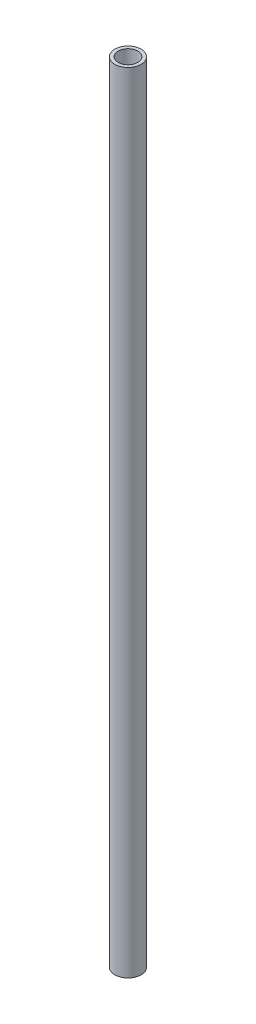
ISO-10303-21;
HEADER;
FILE_DESCRIPTION(('STEP AP214'),'2;1');
FILE_NAME('part.step','',(''),(''),'','','');
FILE_SCHEMA(('AUTOMOTIVE_DESIGN { 1 0 10303 214 1 1 1 1 }'));
ENDSEC;
DATA;
#1=APPLICATION_CONTEXT('core data for automotive mechanical design processes');
#2=APPLICATION_PROTOCOL_DEFINITION('international standard','automotive_design',2000,#1);
#3=PRODUCT_CONTEXT('',#1,'mechanical');
#4=PRODUCT('Part','Part','',(#3));
#5=PRODUCT_RELATED_PRODUCT_CATEGORY('part','',(#4));
#6=PRODUCT_DEFINITION_FORMATION('','',#4);
#7=PRODUCT_DEFINITION_CONTEXT('part definition',#1,'design');
#8=PRODUCT_DEFINITION('design','',#6,#7);
#9=PRODUCT_DEFINITION_SHAPE('','',#8);
#10=(LENGTH_UNIT() NAMED_UNIT(*) SI_UNIT(.MILLI.,.METRE.));
#11=(NAMED_UNIT(*) PLANE_ANGLE_UNIT() SI_UNIT($,.RADIAN.));
#12=(NAMED_UNIT(*) SI_UNIT($,.STERADIAN.) SOLID_ANGLE_UNIT());
#13=UNCERTAINTY_MEASURE_WITH_UNIT(LENGTH_MEASURE(1.E-05),#10,'distance_accuracy_value','');
#14=(GEOMETRIC_REPRESENTATION_CONTEXT(3) GLOBAL_UNCERTAINTY_ASSIGNED_CONTEXT((#13)) GLOBAL_UNIT_ASSIGNED_CONTEXT((#10,
#11,#12)) REPRESENTATION_CONTEXT('',''));
#15=CARTESIAN_POINT('',(0.,0.,0.));
#16=DIRECTION('',(0.,0.,1.));
#17=DIRECTION('',(1.,0.,0.));
#18=AXIS2_PLACEMENT_3D('',#15,#16,#17);
#19=CARTESIAN_POINT('',(0.,60.,0.));
#20=DIRECTION('',(0.,-1.,0.));
#21=DIRECTION('',(0.,0.,-1.));
#22=AXIS2_PLACEMENT_3D('',#19,#20,#21);
#23=CYLINDRICAL_SURFACE('',#22,1.);
#24=CARTESIAN_POINT('',(0.,60.,0.));
#25=DIRECTION('',(0.,1.,0.));
#26=DIRECTION('',(0.,0.,1.));
#27=AXIS2_PLACEMENT_3D('',#24,#25,#26);
#28=CIRCLE('',#27,1.);
#29=CARTESIAN_POINT('',(0.,60.,1.));
#30=VERTEX_POINT('',#29);
#31=EDGE_CURVE('E10',#30,#30,#28,.T.);
#32=ORIENTED_EDGE('',*,*,#31,.F.);
#33=EDGE_LOOP('',(#32));
#34=FACE_BOUND('',#33,.T.);
#35=CARTESIAN_POINT('',(0.,0.,0.));
#36=DIRECTION('',(0.,1.,0.));
#37=DIRECTION('',(0.,0.,1.));
#38=AXIS2_PLACEMENT_3D('',#35,#36,#37);
#39=CIRCLE('',#38,1.);
#40=CARTESIAN_POINT('',(0.,0.,1.));
#41=VERTEX_POINT('',#40);
#42=EDGE_CURVE('E34',#41,#41,#39,.T.);
#43=ORIENTED_EDGE('',*,*,#42,.T.);
#44=EDGE_LOOP('',(#43));
#45=FACE_BOUND('',#44,.T.);
#46=ADVANCED_FACE('F31',(#34,#45),#23,.T.);
#47=CARTESIAN_POINT('',(0.,60.,0.));
#48=DIRECTION('',(0.,1.,0.));
#49=DIRECTION('',(0.,0.,1.));
#50=AXIS2_PLACEMENT_3D('',#47,#48,#49);
#51=PLANE('',#50);
#52=CARTESIAN_POINT('',(0.,60.,0.));
#53=DIRECTION('',(0.,-1.,0.));
#54=DIRECTION('',(0.,0.,-1.));
#55=AXIS2_PLACEMENT_3D('',#52,#53,#54);
#56=CIRCLE('',#55,0.75);
#57=CARTESIAN_POINT('',(0.,60.,-0.75));
#58=VERTEX_POINT('',#57);
#59=EDGE_CURVE('E41',#58,#58,#56,.T.);
#60=ORIENTED_EDGE('',*,*,#59,.T.);
#61=EDGE_LOOP('',(#60));
#62=FACE_BOUND('',#61,.T.);
#63=ORIENTED_EDGE('',*,*,#31,.T.);
#64=EDGE_LOOP('',(#63));
#65=FACE_BOUND('',#64,.T.);
#66=ADVANCED_FACE('F49',(#62,#65),#51,.T.);
#67=CARTESIAN_POINT('',(0.,0.,0.));
#68=DIRECTION('',(0.,1.,0.));
#69=DIRECTION('',(0.,0.,1.));
#70=AXIS2_PLACEMENT_3D('',#67,#68,#69);
#71=PLANE('',#70);
#72=CARTESIAN_POINT('',(0.,0.,0.));
#73=DIRECTION('',(0.,-1.,0.));
#74=DIRECTION('',(0.,0.,-1.));
#75=AXIS2_PLACEMENT_3D('',#72,#73,#74);
#76=CIRCLE('',#75,0.75);
#77=CARTESIAN_POINT('',(0.,0.,-0.75));
#78=VERTEX_POINT('',#77);
#79=EDGE_CURVE('E43',#78,#78,#76,.T.);
#80=ORIENTED_EDGE('',*,*,#79,.F.);
#81=EDGE_LOOP('',(#80));
#82=FACE_BOUND('',#81,.T.);
#83=ORIENTED_EDGE('',*,*,#42,.F.);
#84=EDGE_LOOP('',(#83));
#85=FACE_BOUND('',#84,.T.);
#86=ADVANCED_FACE('F54',(#82,#85),#71,.F.);
#87=CARTESIAN_POINT('',(0.,60.,0.));
#88=DIRECTION('',(0.,-1.,0.));
#89=DIRECTION('',(0.,0.,-1.));
#90=AXIS2_PLACEMENT_3D('',#87,#88,#89);
#91=CYLINDRICAL_SURFACE('',#90,0.75);
#92=ORIENTED_EDGE('',*,*,#59,.F.);
#93=EDGE_LOOP('',(#92));
#94=FACE_BOUND('',#93,.T.);
#95=ORIENTED_EDGE('',*,*,#79,.T.);
#96=EDGE_LOOP('',(#95));
#97=FACE_BOUND('',#96,.T.);
#98=ADVANCED_FACE('F51',(#94,#97),#91,.F.);
#99=CLOSED_SHELL('',(#46,#66,#86,#98));
#100=MANIFOLD_SOLID_BREP('B2',#99);
#101=ADVANCED_BREP_SHAPE_REPRESENTATION('',(#18,#100),#14);
#102=SHAPE_DEFINITION_REPRESENTATION(#9,#101);
ENDSEC;
END-ISO-10303-21;
